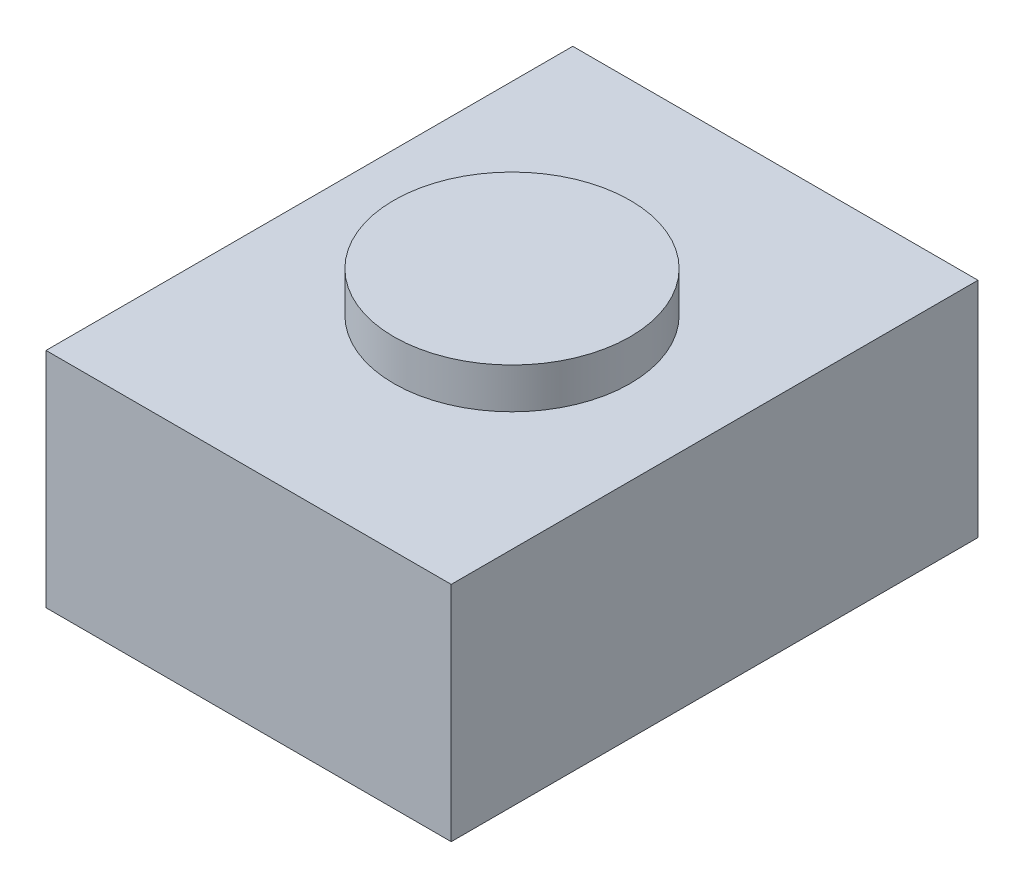
ISO-10303-21;
HEADER;
FILE_DESCRIPTION(('STEP AP214'),'2;1');
FILE_NAME('part.step','',(''),(''),'','','');
FILE_SCHEMA(('AUTOMOTIVE_DESIGN { 1 0 10303 214 1 1 1 1 }'));
ENDSEC;
DATA;
#1=APPLICATION_CONTEXT('core data for automotive mechanical design processes');
#2=APPLICATION_PROTOCOL_DEFINITION('international standard','automotive_design',2000,#1);
#3=PRODUCT_CONTEXT('',#1,'mechanical');
#4=PRODUCT('Part','Part','',(#3));
#5=PRODUCT_RELATED_PRODUCT_CATEGORY('part','',(#4));
#6=PRODUCT_DEFINITION_FORMATION('','',#4);
#7=PRODUCT_DEFINITION_CONTEXT('part definition',#1,'design');
#8=PRODUCT_DEFINITION('design','',#6,#7);
#9=PRODUCT_DEFINITION_SHAPE('','',#8);
#10=(LENGTH_UNIT() NAMED_UNIT(*) SI_UNIT(.MILLI.,.METRE.));
#11=(NAMED_UNIT(*) PLANE_ANGLE_UNIT() SI_UNIT($,.RADIAN.));
#12=(NAMED_UNIT(*) SI_UNIT($,.STERADIAN.) SOLID_ANGLE_UNIT());
#13=UNCERTAINTY_MEASURE_WITH_UNIT(LENGTH_MEASURE(1.E-05),#10,'distance_accuracy_value','');
#14=(GEOMETRIC_REPRESENTATION_CONTEXT(3) GLOBAL_UNCERTAINTY_ASSIGNED_CONTEXT((#13)) GLOBAL_UNIT_ASSIGNED_CONTEXT((#10,
#11,#12)) REPRESENTATION_CONTEXT('',''));
#15=CARTESIAN_POINT('',(0.,0.,0.));
#16=DIRECTION('',(0.,0.,1.));
#17=DIRECTION('',(1.,0.,0.));
#18=AXIS2_PLACEMENT_3D('',#15,#16,#17);
#19=CARTESIAN_POINT('',(7.00000010430813,1.31,-20.0000002980232));
#20=DIRECTION('',(0.,-1.,0.));
#21=DIRECTION('',(0.,0.,-1.));
#22=AXIS2_PLACEMENT_3D('',#19,#20,#21);
#23=PLANE('',#22);
#24=DIRECTION('',(1.,0.,0.));
#25=VECTOR('',#24,1.);
#26=CARTESIAN_POINT('',(5.50000010430813,1.31,-21.9500002980232));
#27=LINE('',#26,#25);
#28=CARTESIAN_POINT('',(5.50000010430813,1.31,-21.9500002980232));
#29=VERTEX_POINT('',#28);
#30=CARTESIAN_POINT('',(8.50000010430813,1.31,-21.9500002980232));
#31=VERTEX_POINT('',#30);
#32=EDGE_CURVE('P0_E55',#29,#31,#27,.T.);
#33=ORIENTED_EDGE('',*,*,#32,.T.);
#34=DIRECTION('',(0.,0.,1.));
#35=VECTOR('',#34,1.);
#36=CARTESIAN_POINT('',(8.50000010430813,1.31,-21.9500002980232));
#37=LINE('',#36,#35);
#38=CARTESIAN_POINT('',(8.50000010430813,1.31,-18.0500002980232));
#39=VERTEX_POINT('',#38);
#40=EDGE_CURVE('P0_E76',#31,#39,#37,.T.);
#41=ORIENTED_EDGE('',*,*,#40,.T.);
#42=DIRECTION('',(-1.,0.,0.));
#43=VECTOR('',#42,1.);
#44=CARTESIAN_POINT('',(8.50000010430813,1.31,-18.0500002980232));
#45=LINE('',#44,#43);
#46=CARTESIAN_POINT('',(5.50000010430813,1.31,-18.0500002980232));
#47=VERTEX_POINT('',#46);
#48=EDGE_CURVE('P0_E58',#39,#47,#45,.T.);
#49=ORIENTED_EDGE('',*,*,#48,.T.);
#50=DIRECTION('',(0.,0.,-1.));
#51=VECTOR('',#50,1.);
#52=CARTESIAN_POINT('',(5.50000010430813,1.31,-18.0500002980232));
#53=LINE('',#52,#51);
#54=EDGE_CURVE('P0_E20',#47,#29,#53,.T.);
#55=ORIENTED_EDGE('',*,*,#54,.T.);
#56=EDGE_LOOP('',(#33,#41,#49,#55));
#57=FACE_BOUND('',#56,.T.);
#58=ADVANCED_FACE('P0_F17',(#57),#23,.T.);
#59=CARTESIAN_POINT('',(5.50000010430813,1.31,-18.0500002980232));
#60=DIRECTION('',(1.,0.,0.));
#61=DIRECTION('',(0.,0.,-1.));
#62=AXIS2_PLACEMENT_3D('',#59,#60,#61);
#63=PLANE('',#62);
#64=DIRECTION('',(0.,1.,0.));
#65=VECTOR('',#64,1.);
#66=CARTESIAN_POINT('',(5.50000010430813,1.31,-18.0500002980232));
#67=LINE('',#66,#65);
#68=CARTESIAN_POINT('',(5.50000010430813,2.96,-18.0500002980232));
#69=VERTEX_POINT('',#68);
#70=EDGE_CURVE('P0_E78',#47,#69,#67,.T.);
#71=ORIENTED_EDGE('',*,*,#70,.T.);
#72=DIRECTION('',(0.,0.,-1.));
#73=VECTOR('',#72,1.);
#74=CARTESIAN_POINT('',(5.50000010430813,2.96,-20.0000002980232));
#75=LINE('',#74,#73);
#76=CARTESIAN_POINT('',(5.50000010430813,2.96,-21.9500002980232));
#77=VERTEX_POINT('',#76);
#78=EDGE_CURVE('P0_E73',#69,#77,#75,.T.);
#79=ORIENTED_EDGE('',*,*,#78,.T.);
#80=DIRECTION('',(0.,1.,0.));
#81=VECTOR('',#80,1.);
#82=CARTESIAN_POINT('',(5.50000010430813,1.31,-21.9500002980232));
#83=LINE('',#82,#81);
#84=EDGE_CURVE('P0_E63',#77,#29,#83,.F.);
#85=ORIENTED_EDGE('',*,*,#84,.T.);
#86=ORIENTED_EDGE('',*,*,#54,.F.);
#87=EDGE_LOOP('',(#71,#79,#85,#86));
#88=FACE_BOUND('',#87,.T.);
#89=ADVANCED_FACE('P0_F72',(#88),#63,.F.);
#90=CARTESIAN_POINT('',(5.50000010430813,1.31,-21.9500002980232));
#91=DIRECTION('',(0.,0.,1.));
#92=DIRECTION('',(1.,0.,0.));
#93=AXIS2_PLACEMENT_3D('',#90,#91,#92);
#94=PLANE('',#93);
#95=ORIENTED_EDGE('',*,*,#84,.F.);
#96=DIRECTION('',(1.,0.,0.));
#97=VECTOR('',#96,1.);
#98=CARTESIAN_POINT('',(7.00000010430813,2.96,-21.9500002980232));
#99=LINE('',#98,#97);
#100=CARTESIAN_POINT('',(8.50000010430813,2.96,-21.9500002980232));
#101=VERTEX_POINT('',#100);
#102=EDGE_CURVE('P0_E83',#77,#101,#99,.T.);
#103=ORIENTED_EDGE('',*,*,#102,.T.);
#104=DIRECTION('',(0.,1.,0.));
#105=VECTOR('',#104,1.);
#106=CARTESIAN_POINT('',(8.50000010430813,1.31,-21.9500002980232));
#107=LINE('',#106,#105);
#108=EDGE_CURVE('P0_E69',#101,#31,#107,.F.);
#109=ORIENTED_EDGE('',*,*,#108,.T.);
#110=ORIENTED_EDGE('',*,*,#32,.F.);
#111=EDGE_LOOP('',(#95,#103,#109,#110));
#112=FACE_BOUND('',#111,.T.);
#113=ADVANCED_FACE('P0_F66',(#112),#94,.F.);
#114=CARTESIAN_POINT('',(8.50000010430813,1.31,-21.9500002980232));
#115=DIRECTION('',(-1.,0.,0.));
#116=DIRECTION('',(0.,0.,1.));
#117=AXIS2_PLACEMENT_3D('',#114,#115,#116);
#118=PLANE('',#117);
#119=ORIENTED_EDGE('',*,*,#108,.F.);
#120=DIRECTION('',(0.,0.,-1.));
#121=VECTOR('',#120,1.);
#122=CARTESIAN_POINT('',(8.50000010430813,2.96,-20.0000002980232));
#123=LINE('',#122,#121);
#124=CARTESIAN_POINT('',(8.50000010430813,2.96,-18.0500002980232));
#125=VERTEX_POINT('',#124);
#126=EDGE_CURVE('P0_E26',#101,#125,#123,.F.);
#127=ORIENTED_EDGE('',*,*,#126,.T.);
#128=DIRECTION('',(0.,1.,0.));
#129=VECTOR('',#128,1.);
#130=CARTESIAN_POINT('',(8.50000010430813,1.31,-18.0500002980232));
#131=LINE('',#130,#129);
#132=EDGE_CURVE('P0_E34',#125,#39,#131,.F.);
#133=ORIENTED_EDGE('',*,*,#132,.T.);
#134=ORIENTED_EDGE('',*,*,#40,.F.);
#135=EDGE_LOOP('',(#119,#127,#133,#134));
#136=FACE_BOUND('',#135,.T.);
#137=ADVANCED_FACE('P0_F88',(#136),#118,.F.);
#138=CARTESIAN_POINT('',(8.50000010430813,1.31,-18.0500002980232));
#139=DIRECTION('',(0.,0.,-1.));
#140=DIRECTION('',(-1.,0.,0.));
#141=AXIS2_PLACEMENT_3D('',#138,#139,#140);
#142=PLANE('',#141);
#143=ORIENTED_EDGE('',*,*,#132,.F.);
#144=DIRECTION('',(1.,0.,0.));
#145=VECTOR('',#144,1.);
#146=CARTESIAN_POINT('',(7.00000010430813,2.96,-18.0500002980232));
#147=LINE('',#146,#145);
#148=EDGE_CURVE('P0_E11',#125,#69,#147,.F.);
#149=ORIENTED_EDGE('',*,*,#148,.T.);
#150=ORIENTED_EDGE('',*,*,#70,.F.);
#151=ORIENTED_EDGE('',*,*,#48,.F.);
#152=EDGE_LOOP('',(#143,#149,#150,#151));
#153=FACE_BOUND('',#152,.T.);
#154=ADVANCED_FACE('P0_F91',(#153),#142,.F.);
#155=CARTESIAN_POINT('',(7.00000010430813,2.96,-20.0000002980232));
#156=DIRECTION('',(0.,-1.,0.));
#157=DIRECTION('',(0.,0.,-1.));
#158=AXIS2_PLACEMENT_3D('',#155,#156,#157);
#159=PLANE('',#158);
#160=ORIENTED_EDGE('',*,*,#126,.F.);
#161=ORIENTED_EDGE('',*,*,#102,.F.);
#162=ORIENTED_EDGE('',*,*,#78,.F.);
#163=ORIENTED_EDGE('',*,*,#148,.F.);
#164=EDGE_LOOP('',(#160,#161,#162,#163));
#165=FACE_BOUND('',#164,.T.);
#166=ADVANCED_FACE('P0_F90',(#165),#159,.F.);
#167=CLOSED_SHELL('',(#58,#89,#113,#137,#154,#166));
#168=MANIFOLD_SOLID_BREP('P0_B1',#167);
#169=CARTESIAN_POINT('',(7.00000010430813,2.96,-20.0000002980232));
#170=DIRECTION('',(0.,-1.,0.));
#171=DIRECTION('',(0.,0.,-1.));
#172=AXIS2_PLACEMENT_3D('',#169,#170,#171);
#173=PLANE('',#172);
#174=CARTESIAN_POINT('',(7.00000010430813,2.96,-20.0000002980232));
#175=DIRECTION('',(0.,-1.,0.));
#176=DIRECTION('',(0.,0.,-1.));
#177=AXIS2_PLACEMENT_3D('',#174,#175,#176);
#178=CIRCLE('',#177,0.875000000000001);
#179=CARTESIAN_POINT('',(7.00000010430813,2.96,-20.8750002980232));
#180=VERTEX_POINT('',#179);
#181=EDGE_CURVE('P1_E18',#180,#180,#178,.F.);
#182=ORIENTED_EDGE('',*,*,#181,.F.);
#183=EDGE_LOOP('',(#182));
#184=FACE_BOUND('',#183,.T.);
#185=ADVANCED_FACE('P1_F15',(#184),#173,.T.);
#186=CARTESIAN_POINT('',(7.00000010430813,2.96,-20.0000002980232));
#187=DIRECTION('',(0.,-1.,0.));
#188=DIRECTION('',(0.,0.,-1.));
#189=AXIS2_PLACEMENT_3D('',#186,#187,#188);
#190=CYLINDRICAL_SURFACE('',#189,0.875000000000001);
#191=ORIENTED_EDGE('',*,*,#181,.T.);
#192=EDGE_LOOP('',(#191));
#193=FACE_BOUND('',#192,.T.);
#194=CARTESIAN_POINT('',(7.00000010430813,3.26,-20.0000002980232));
#195=DIRECTION('',(0.,-1.,0.));
#196=DIRECTION('',(0.,0.,-1.));
#197=AXIS2_PLACEMENT_3D('',#194,#195,#196);
#198=CIRCLE('',#197,0.875000000000001);
#199=CARTESIAN_POINT('',(7.00000010430813,3.26,-20.8750002980232));
#200=VERTEX_POINT('',#199);
#201=EDGE_CURVE('P1_E10',#200,#200,#198,.T.);
#202=ORIENTED_EDGE('',*,*,#201,.T.);
#203=EDGE_LOOP('',(#202));
#204=FACE_BOUND('',#203,.T.);
#205=ADVANCED_FACE('P1_F27',(#193,#204),#190,.T.);
#206=CARTESIAN_POINT('',(7.00000010430813,3.26,-20.0000002980232));
#207=DIRECTION('',(0.,-1.,0.));
#208=DIRECTION('',(0.,0.,-1.));
#209=AXIS2_PLACEMENT_3D('',#206,#207,#208);
#210=PLANE('',#209);
#211=ORIENTED_EDGE('',*,*,#201,.F.);
#212=EDGE_LOOP('',(#211));
#213=FACE_BOUND('',#212,.T.);
#214=ADVANCED_FACE('P1_F34',(#213),#210,.F.);
#215=CLOSED_SHELL('',(#185,#205,#214));
#216=MANIFOLD_SOLID_BREP('P1_B1',#215);
#217=ADVANCED_BREP_SHAPE_REPRESENTATION('',(#18,#168,#216),#14);
#218=SHAPE_DEFINITION_REPRESENTATION(#9,#217);
ENDSEC;
END-ISO-10303-21;
